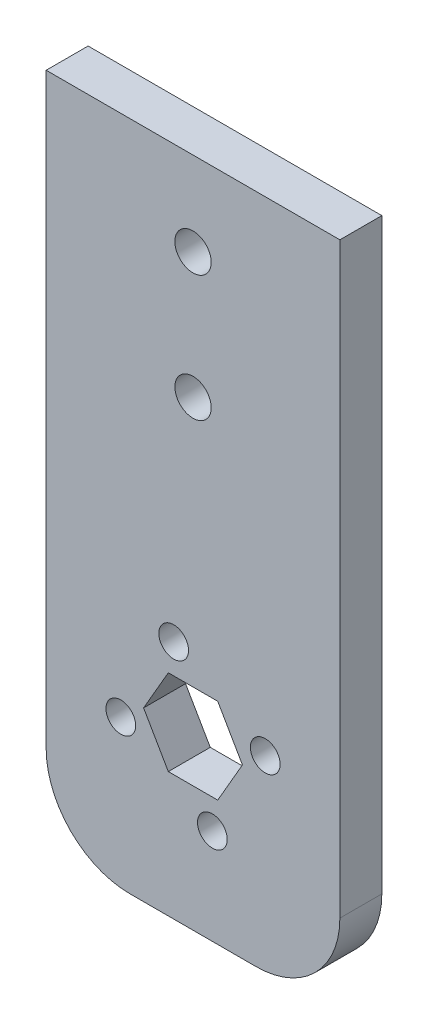
ISO-10303-21;
HEADER;
FILE_DESCRIPTION(('STEP AP214'),'2;1');
FILE_NAME('part.step','',(''),(''),'','','');
FILE_SCHEMA(('AUTOMOTIVE_DESIGN { 1 0 10303 214 1 1 1 1 }'));
ENDSEC;
DATA;
#1=APPLICATION_CONTEXT('core data for automotive mechanical design processes');
#2=APPLICATION_PROTOCOL_DEFINITION('international standard','automotive_design',2000,#1);
#3=PRODUCT_CONTEXT('',#1,'mechanical');
#4=PRODUCT('Part','Part','',(#3));
#5=PRODUCT_RELATED_PRODUCT_CATEGORY('part','',(#4));
#6=PRODUCT_DEFINITION_FORMATION('','',#4);
#7=PRODUCT_DEFINITION_CONTEXT('part definition',#1,'design');
#8=PRODUCT_DEFINITION('design','',#6,#7);
#9=PRODUCT_DEFINITION_SHAPE('','',#8);
#10=(LENGTH_UNIT() NAMED_UNIT(*) SI_UNIT(.MILLI.,.METRE.));
#11=(NAMED_UNIT(*) PLANE_ANGLE_UNIT() SI_UNIT($,.RADIAN.));
#12=(NAMED_UNIT(*) SI_UNIT($,.STERADIAN.) SOLID_ANGLE_UNIT());
#13=UNCERTAINTY_MEASURE_WITH_UNIT(LENGTH_MEASURE(1.E-05),#10,'distance_accuracy_value','');
#14=(GEOMETRIC_REPRESENTATION_CONTEXT(3) GLOBAL_UNCERTAINTY_ASSIGNED_CONTEXT((#13)) GLOBAL_UNIT_ASSIGNED_CONTEXT((#10,
#11,#12)) REPRESENTATION_CONTEXT('',''));
#15=CARTESIAN_POINT('',(0.,0.,0.));
#16=DIRECTION('',(0.,0.,1.));
#17=DIRECTION('',(1.,0.,0.));
#18=AXIS2_PLACEMENT_3D('',#15,#16,#17);
#19=CARTESIAN_POINT('',(0.,0.,0.));
#20=DIRECTION('',(0.,0.,1.));
#21=DIRECTION('',(1.,0.,0.));
#22=AXIS2_PLACEMENT_3D('',#19,#20,#21);
#23=PLANE('',#22);
#24=CARTESIAN_POINT('',(-25.1532032302754,36.3282032302756,0.));
#25=DIRECTION('',(0.,0.,-1.));
#26=DIRECTION('',(-1.,0.,0.));
#27=AXIS2_PLACEMENT_3D('',#24,#25,#26);
#28=CIRCLE('',#27,2.25);
#29=CARTESIAN_POINT('',(-27.4032032302754,36.3282032302756,0.));
#30=VERTEX_POINT('',#29);
#31=EDGE_CURVE('E509',#30,#30,#28,.T.);
#32=ORIENTED_EDGE('',*,*,#31,.F.);
#33=EDGE_LOOP('',(#32));
#34=FACE_BOUND('',#33,.T.);
#35=CARTESIAN_POINT('',(-33.1532032302755,22.4717967697245,0.));
#36=DIRECTION('',(0.,0.,-1.));
#37=DIRECTION('',(-1.,0.,0.));
#38=AXIS2_PLACEMENT_3D('',#35,#36,#37);
#39=CIRCLE('',#38,2.25);
#40=CARTESIAN_POINT('',(-35.4032032302755,22.4717967697245,0.));
#41=VERTEX_POINT('',#40);
#42=EDGE_CURVE('E519',#41,#41,#39,.T.);
#43=ORIENTED_EDGE('',*,*,#42,.F.);
#44=EDGE_LOOP('',(#43));
#45=FACE_BOUND('',#44,.T.);
#46=CARTESIAN_POINT('',(-19.2967967697245,14.4717967697245,0.));
#47=DIRECTION('',(0.,0.,-1.));
#48=DIRECTION('',(-1.,0.,0.));
#49=AXIS2_PLACEMENT_3D('',#46,#47,#48);
#50=CIRCLE('',#49,2.25);
#51=CARTESIAN_POINT('',(-21.5467967697245,14.4717967697245,0.));
#52=VERTEX_POINT('',#51);
#53=EDGE_CURVE('E526',#52,#52,#50,.T.);
#54=ORIENTED_EDGE('',*,*,#53,.F.);
#55=EDGE_LOOP('',(#54));
#56=FACE_BOUND('',#55,.T.);
#57=DIRECTION('',(1.,0.,0.));
#58=VECTOR('',#57,1.);
#59=CARTESIAN_POINT('',(-25.9644976935412,18.923,0.));
#60=LINE('',#59,#58);
#61=CARTESIAN_POINT('',(-25.9644976935412,18.923,0.));
#62=VERTEX_POINT('',#61);
#63=CARTESIAN_POINT('',(-18.4855023064588,18.923,0.));
#64=VERTEX_POINT('',#63);
#65=EDGE_CURVE('E142',#62,#64,#60,.T.);
#66=ORIENTED_EDGE('',*,*,#65,.T.);
#67=DIRECTION('',(0.500000000000001,0.866025403784438,0.));
#68=VECTOR('',#67,1.);
#69=CARTESIAN_POINT('',(-18.4855023064588,18.923,0.));
#70=LINE('',#69,#68);
#71=CARTESIAN_POINT('',(-14.7460046129176,25.4,0.));
#72=VERTEX_POINT('',#71);
#73=EDGE_CURVE('E135',#64,#72,#70,.T.);
#74=ORIENTED_EDGE('',*,*,#73,.T.);
#75=DIRECTION('',(-0.499999999999999,0.866025403784439,0.));
#76=VECTOR('',#75,1.);
#77=CARTESIAN_POINT('',(-14.7460046129176,25.4,0.));
#78=LINE('',#77,#76);
#79=CARTESIAN_POINT('',(-18.4855023064588,31.877,0.));
#80=VERTEX_POINT('',#79);
#81=EDGE_CURVE('E145',#72,#80,#78,.T.);
#82=ORIENTED_EDGE('',*,*,#81,.T.);
#83=DIRECTION('',(-1.,0.,0.));
#84=VECTOR('',#83,1.);
#85=CARTESIAN_POINT('',(-18.4855023064588,31.877,0.));
#86=LINE('',#85,#84);
#87=CARTESIAN_POINT('',(-25.9644976935412,31.877,0.));
#88=VERTEX_POINT('',#87);
#89=EDGE_CURVE('E67',#80,#88,#86,.T.);
#90=ORIENTED_EDGE('',*,*,#89,.T.);
#91=DIRECTION('',(-0.5,-0.866025403784438,0.));
#92=VECTOR('',#91,1.);
#93=CARTESIAN_POINT('',(-25.9644976935412,31.877,0.));
#94=LINE('',#93,#92);
#95=CARTESIAN_POINT('',(-29.7039953870824,25.4,0.));
#96=VERTEX_POINT('',#95);
#97=EDGE_CURVE('E166',#88,#96,#94,.T.);
#98=ORIENTED_EDGE('',*,*,#97,.T.);
#99=DIRECTION('',(0.499999999999999,-0.866025403784439,0.));
#100=VECTOR('',#99,1.);
#101=CARTESIAN_POINT('',(-29.7039953870824,25.4,0.));
#102=LINE('',#101,#100);
#103=EDGE_CURVE('E170',#96,#62,#102,.T.);
#104=ORIENTED_EDGE('',*,*,#103,.T.);
#105=EDGE_LOOP('',(#66,#74,#82,#90,#98,#104));
#106=FACE_BOUND('',#105,.T.);
#107=CARTESIAN_POINT('',(-22.225,88.9,0.));
#108=DIRECTION('',(0.,0.,-1.));
#109=DIRECTION('',(-1.,0.,0.));
#110=AXIS2_PLACEMENT_3D('',#107,#108,#109);
#111=CIRCLE('',#110,2.75);
#112=CARTESIAN_POINT('',(-24.975,88.9,0.));
#113=VERTEX_POINT('',#112);
#114=EDGE_CURVE('E194',#113,#113,#111,.T.);
#115=ORIENTED_EDGE('',*,*,#114,.F.);
#116=EDGE_LOOP('',(#115));
#117=FACE_BOUND('',#116,.T.);
#118=CARTESIAN_POINT('',(-22.225,69.85,0.));
#119=DIRECTION('',(0.,0.,-1.));
#120=DIRECTION('',(-1.,0.,0.));
#121=AXIS2_PLACEMENT_3D('',#118,#119,#120);
#122=CIRCLE('',#121,2.75);
#123=CARTESIAN_POINT('',(-24.975,69.85,0.));
#124=VERTEX_POINT('',#123);
#125=EDGE_CURVE('E213',#124,#124,#122,.T.);
#126=ORIENTED_EDGE('',*,*,#125,.F.);
#127=EDGE_LOOP('',(#126));
#128=FACE_BOUND('',#127,.T.);
#129=DIRECTION('',(1.,0.,0.));
#130=VECTOR('',#129,1.);
#131=CARTESIAN_POINT('',(0.,0.,0.));
#132=LINE('',#131,#130);
#133=CARTESIAN_POINT('',(-31.75,0.,0.));
#134=VERTEX_POINT('',#133);
#135=CARTESIAN_POINT('',(-12.7,0.,0.));
#136=VERTEX_POINT('',#135);
#137=EDGE_CURVE('E226',#134,#136,#132,.T.);
#138=ORIENTED_EDGE('',*,*,#137,.F.);
#139=CARTESIAN_POINT('',(-31.75,12.7,0.));
#140=DIRECTION('',(0.,0.,1.));
#141=DIRECTION('',(1.,0.,0.));
#142=AXIS2_PLACEMENT_3D('',#139,#140,#141);
#143=CIRCLE('',#142,12.7);
#144=CARTESIAN_POINT('',(-44.45,12.7,0.));
#145=VERTEX_POINT('',#144);
#146=EDGE_CURVE('E267',#134,#145,#143,.F.);
#147=ORIENTED_EDGE('',*,*,#146,.T.);
#148=DIRECTION('',(0.,-1.,0.));
#149=VECTOR('',#148,1.);
#150=CARTESIAN_POINT('',(-44.45,0.,0.));
#151=LINE('',#150,#149);
#152=CARTESIAN_POINT('',(-44.45,101.6,0.));
#153=VERTEX_POINT('',#152);
#154=EDGE_CURVE('E243',#153,#145,#151,.T.);
#155=ORIENTED_EDGE('',*,*,#154,.F.);
#156=DIRECTION('',(-1.,0.,0.));
#157=VECTOR('',#156,1.);
#158=CARTESIAN_POINT('',(0.,101.6,0.));
#159=LINE('',#158,#157);
#160=CARTESIAN_POINT('',(0.,101.6,0.));
#161=VERTEX_POINT('',#160);
#162=EDGE_CURVE('E240',#161,#153,#159,.T.);
#163=ORIENTED_EDGE('',*,*,#162,.F.);
#164=DIRECTION('',(0.,1.,0.));
#165=VECTOR('',#164,1.);
#166=CARTESIAN_POINT('',(0.,0.,0.));
#167=LINE('',#166,#165);
#168=CARTESIAN_POINT('',(0.,12.7,0.));
#169=VERTEX_POINT('',#168);
#170=EDGE_CURVE('E221',#169,#161,#167,.T.);
#171=ORIENTED_EDGE('',*,*,#170,.F.);
#172=CARTESIAN_POINT('',(-12.7,12.7,0.));
#173=DIRECTION('',(0.,0.,1.));
#174=DIRECTION('',(1.,0.,0.));
#175=AXIS2_PLACEMENT_3D('',#172,#173,#174);
#176=CIRCLE('',#175,12.7);
#177=EDGE_CURVE('E264',#169,#136,#176,.F.);
#178=ORIENTED_EDGE('',*,*,#177,.T.);
#179=EDGE_LOOP('',(#138,#147,#155,#163,#171,#178));
#180=FACE_BOUND('',#179,.T.);
#181=CARTESIAN_POINT('',(-11.2967967697244,28.3282032302755,0.));
#182=DIRECTION('',(0.,0.,-1.));
#183=DIRECTION('',(-1.,0.,0.));
#184=AXIS2_PLACEMENT_3D('',#181,#182,#183);
#185=CIRCLE('',#184,2.25);
#186=CARTESIAN_POINT('',(-13.5467967697244,28.3282032302755,0.));
#187=VERTEX_POINT('',#186);
#188=EDGE_CURVE('E505',#187,#187,#185,.T.);
#189=ORIENTED_EDGE('',*,*,#188,.F.);
#190=EDGE_LOOP('',(#189));
#191=FACE_BOUND('',#190,.T.);
#192=ADVANCED_FACE('F43',(#34,#45,#56,#106,#117,#128,#180,#191),#23,.F.);
#193=CARTESIAN_POINT('',(0.,0.,6.35));
#194=DIRECTION('',(0.,0.,1.));
#195=DIRECTION('',(1.,0.,0.));
#196=AXIS2_PLACEMENT_3D('',#193,#194,#195);
#197=PLANE('',#196);
#198=CARTESIAN_POINT('',(-11.2967967697244,28.3282032302755,6.35));
#199=DIRECTION('',(0.,0.,-1.));
#200=DIRECTION('',(-1.,0.,0.));
#201=AXIS2_PLACEMENT_3D('',#198,#199,#200);
#202=CIRCLE('',#201,2.25);
#203=CARTESIAN_POINT('',(-13.5467967697244,28.3282032302755,6.35));
#204=VERTEX_POINT('',#203);
#205=EDGE_CURVE('E502',#204,#204,#202,.T.);
#206=ORIENTED_EDGE('',*,*,#205,.T.);
#207=EDGE_LOOP('',(#206));
#208=FACE_BOUND('',#207,.T.);
#209=DIRECTION('',(0.,-1.,0.));
#210=VECTOR('',#209,1.);
#211=CARTESIAN_POINT('',(-44.45,0.,6.35));
#212=LINE('',#211,#210);
#213=CARTESIAN_POINT('',(-44.45,101.6,6.35));
#214=VERTEX_POINT('',#213);
#215=CARTESIAN_POINT('',(-44.45,12.7,6.35));
#216=VERTEX_POINT('',#215);
#217=EDGE_CURVE('E229',#214,#216,#212,.T.);
#218=ORIENTED_EDGE('',*,*,#217,.T.);
#219=CARTESIAN_POINT('',(-31.75,12.7,6.35));
#220=DIRECTION('',(0.,0.,1.));
#221=DIRECTION('',(1.,0.,0.));
#222=AXIS2_PLACEMENT_3D('',#219,#220,#221);
#223=CIRCLE('',#222,12.7);
#224=CARTESIAN_POINT('',(-31.75,0.,6.35));
#225=VERTEX_POINT('',#224);
#226=EDGE_CURVE('E52',#216,#225,#223,.T.);
#227=ORIENTED_EDGE('',*,*,#226,.T.);
#228=DIRECTION('',(1.,0.,0.));
#229=VECTOR('',#228,1.);
#230=CARTESIAN_POINT('',(0.,0.,6.35));
#231=LINE('',#230,#229);
#232=CARTESIAN_POINT('',(-12.7,0.,6.35));
#233=VERTEX_POINT('',#232);
#234=EDGE_CURVE('E233',#225,#233,#231,.T.);
#235=ORIENTED_EDGE('',*,*,#234,.T.);
#236=CARTESIAN_POINT('',(-12.7,12.7,6.35));
#237=DIRECTION('',(0.,0.,1.));
#238=DIRECTION('',(1.,0.,0.));
#239=AXIS2_PLACEMENT_3D('',#236,#237,#238);
#240=CIRCLE('',#239,12.7);
#241=CARTESIAN_POINT('',(0.,12.7,6.35));
#242=VERTEX_POINT('',#241);
#243=EDGE_CURVE('E273',#233,#242,#240,.T.);
#244=ORIENTED_EDGE('',*,*,#243,.T.);
#245=DIRECTION('',(0.,1.,0.));
#246=VECTOR('',#245,1.);
#247=CARTESIAN_POINT('',(0.,0.,6.35));
#248=LINE('',#247,#246);
#249=CARTESIAN_POINT('',(0.,101.6,6.35));
#250=VERTEX_POINT('',#249);
#251=EDGE_CURVE('E222',#242,#250,#248,.T.);
#252=ORIENTED_EDGE('',*,*,#251,.T.);
#253=DIRECTION('',(-1.,0.,0.));
#254=VECTOR('',#253,1.);
#255=CARTESIAN_POINT('',(0.,101.6,6.35));
#256=LINE('',#255,#254);
#257=EDGE_CURVE('E225',#250,#214,#256,.T.);
#258=ORIENTED_EDGE('',*,*,#257,.T.);
#259=EDGE_LOOP('',(#218,#227,#235,#244,#252,#258));
#260=FACE_BOUND('',#259,.T.);
#261=CARTESIAN_POINT('',(-22.225,69.85,6.35));
#262=DIRECTION('',(0.,0.,-1.));
#263=DIRECTION('',(-1.,0.,0.));
#264=AXIS2_PLACEMENT_3D('',#261,#262,#263);
#265=CIRCLE('',#264,2.75);
#266=CARTESIAN_POINT('',(-24.975,69.85,6.35));
#267=VERTEX_POINT('',#266);
#268=EDGE_CURVE('E217',#267,#267,#265,.T.);
#269=ORIENTED_EDGE('',*,*,#268,.T.);
#270=EDGE_LOOP('',(#269));
#271=FACE_BOUND('',#270,.T.);
#272=CARTESIAN_POINT('',(-22.225,88.9,6.35));
#273=DIRECTION('',(0.,0.,-1.));
#274=DIRECTION('',(-1.,0.,0.));
#275=AXIS2_PLACEMENT_3D('',#272,#273,#274);
#276=CIRCLE('',#275,2.75);
#277=CARTESIAN_POINT('',(-24.975,88.9,6.35));
#278=VERTEX_POINT('',#277);
#279=EDGE_CURVE('E209',#278,#278,#276,.T.);
#280=ORIENTED_EDGE('',*,*,#279,.T.);
#281=EDGE_LOOP('',(#280));
#282=FACE_BOUND('',#281,.T.);
#283=DIRECTION('',(0.500000000000001,0.866025403784438,0.));
#284=VECTOR('',#283,1.);
#285=CARTESIAN_POINT('',(-18.4855023064588,18.923,6.35));
#286=LINE('',#285,#284);
#287=CARTESIAN_POINT('',(-18.4855023064588,18.923,6.35));
#288=VERTEX_POINT('',#287);
#289=CARTESIAN_POINT('',(-14.7460046129176,25.4,6.35));
#290=VERTEX_POINT('',#289);
#291=EDGE_CURVE('E59',#288,#290,#286,.T.);
#292=ORIENTED_EDGE('',*,*,#291,.F.);
#293=DIRECTION('',(1.,0.,0.));
#294=VECTOR('',#293,1.);
#295=CARTESIAN_POINT('',(-25.9644976935412,18.923,6.35));
#296=LINE('',#295,#294);
#297=CARTESIAN_POINT('',(-25.9644976935412,18.923,6.35));
#298=VERTEX_POINT('',#297);
#299=EDGE_CURVE('E154',#298,#288,#296,.T.);
#300=ORIENTED_EDGE('',*,*,#299,.F.);
#301=DIRECTION('',(0.499999999999999,-0.866025403784439,0.));
#302=VECTOR('',#301,1.);
#303=CARTESIAN_POINT('',(-29.7039953870824,25.4,6.35));
#304=LINE('',#303,#302);
#305=CARTESIAN_POINT('',(-29.7039953870824,25.4,6.35));
#306=VERTEX_POINT('',#305);
#307=EDGE_CURVE('E158',#306,#298,#304,.T.);
#308=ORIENTED_EDGE('',*,*,#307,.F.);
#309=DIRECTION('',(-0.5,-0.866025403784438,0.));
#310=VECTOR('',#309,1.);
#311=CARTESIAN_POINT('',(-25.9644976935412,31.877,6.35));
#312=LINE('',#311,#310);
#313=CARTESIAN_POINT('',(-25.9644976935412,31.877,6.35));
#314=VERTEX_POINT('',#313);
#315=EDGE_CURVE('E184',#314,#306,#312,.T.);
#316=ORIENTED_EDGE('',*,*,#315,.F.);
#317=DIRECTION('',(-1.,0.,0.));
#318=VECTOR('',#317,1.);
#319=CARTESIAN_POINT('',(-18.4855023064588,31.877,6.35));
#320=LINE('',#319,#318);
#321=CARTESIAN_POINT('',(-18.4855023064588,31.877,6.35));
#322=VERTEX_POINT('',#321);
#323=EDGE_CURVE('E180',#322,#314,#320,.T.);
#324=ORIENTED_EDGE('',*,*,#323,.F.);
#325=DIRECTION('',(-0.499999999999999,0.866025403784439,0.));
#326=VECTOR('',#325,1.);
#327=CARTESIAN_POINT('',(-14.7460046129176,25.4,6.35));
#328=LINE('',#327,#326);
#329=EDGE_CURVE('E177',#290,#322,#328,.T.);
#330=ORIENTED_EDGE('',*,*,#329,.F.);
#331=EDGE_LOOP('',(#292,#300,#308,#316,#324,#330));
#332=FACE_BOUND('',#331,.T.);
#333=CARTESIAN_POINT('',(-19.2967967697245,14.4717967697245,6.35));
#334=DIRECTION('',(0.,0.,-1.));
#335=DIRECTION('',(-1.,0.,0.));
#336=AXIS2_PLACEMENT_3D('',#333,#334,#335);
#337=CIRCLE('',#336,2.25);
#338=CARTESIAN_POINT('',(-21.5467967697245,14.4717967697245,6.35));
#339=VERTEX_POINT('',#338);
#340=EDGE_CURVE('E161',#339,#339,#337,.T.);
#341=ORIENTED_EDGE('',*,*,#340,.T.);
#342=EDGE_LOOP('',(#341));
#343=FACE_BOUND('',#342,.T.);
#344=CARTESIAN_POINT('',(-33.1532032302755,22.4717967697245,6.35));
#345=DIRECTION('',(0.,0.,-1.));
#346=DIRECTION('',(-1.,0.,0.));
#347=AXIS2_PLACEMENT_3D('',#344,#345,#346);
#348=CIRCLE('',#347,2.25);
#349=CARTESIAN_POINT('',(-35.4032032302755,22.4717967697245,6.35));
#350=VERTEX_POINT('',#349);
#351=EDGE_CURVE('E523',#350,#350,#348,.T.);
#352=ORIENTED_EDGE('',*,*,#351,.T.);
#353=EDGE_LOOP('',(#352));
#354=FACE_BOUND('',#353,.T.);
#355=CARTESIAN_POINT('',(-25.1532032302754,36.3282032302756,6.35));
#356=DIRECTION('',(0.,0.,-1.));
#357=DIRECTION('',(-1.,0.,0.));
#358=AXIS2_PLACEMENT_3D('',#355,#356,#357);
#359=CIRCLE('',#358,2.25);
#360=CARTESIAN_POINT('',(-27.4032032302754,36.3282032302756,6.35));
#361=VERTEX_POINT('',#360);
#362=EDGE_CURVE('E515',#361,#361,#359,.T.);
#363=ORIENTED_EDGE('',*,*,#362,.T.);
#364=EDGE_LOOP('',(#363));
#365=FACE_BOUND('',#364,.T.);
#366=ADVANCED_FACE('F279',(#208,#260,#271,#282,#332,#343,#354,#365),#197,.T.);
#367=CARTESIAN_POINT('',(0.,0.,6.35));
#368=DIRECTION('',(-1.,0.,0.));
#369=DIRECTION('',(0.,0.,1.));
#370=AXIS2_PLACEMENT_3D('',#367,#368,#369);
#371=PLANE('',#370);
#372=ORIENTED_EDGE('',*,*,#251,.F.);
#373=DIRECTION('',(0.,0.,-1.));
#374=VECTOR('',#373,1.);
#375=CARTESIAN_POINT('',(0.,12.7,6.35));
#376=LINE('',#375,#374);
#377=EDGE_CURVE('E11',#242,#169,#376,.T.);
#378=ORIENTED_EDGE('',*,*,#377,.T.);
#379=ORIENTED_EDGE('',*,*,#170,.T.);
#380=DIRECTION('',(0.,0.,-1.));
#381=VECTOR('',#380,1.);
#382=CARTESIAN_POINT('',(0.,101.6,6.35));
#383=LINE('',#382,#381);
#384=EDGE_CURVE('E253',#250,#161,#383,.T.);
#385=ORIENTED_EDGE('',*,*,#384,.F.);
#386=EDGE_LOOP('',(#372,#378,#379,#385));
#387=FACE_BOUND('',#386,.T.);
#388=ADVANCED_FACE('F305',(#387),#371,.F.);
#389=CARTESIAN_POINT('',(0.,101.6,6.35));
#390=DIRECTION('',(0.,-1.,0.));
#391=DIRECTION('',(0.,0.,-1.));
#392=AXIS2_PLACEMENT_3D('',#389,#390,#391);
#393=PLANE('',#392);
#394=ORIENTED_EDGE('',*,*,#162,.T.);
#395=DIRECTION('',(0.,0.,-1.));
#396=VECTOR('',#395,1.);
#397=CARTESIAN_POINT('',(-44.45,101.6,6.35));
#398=LINE('',#397,#396);
#399=EDGE_CURVE('E237',#214,#153,#398,.T.);
#400=ORIENTED_EDGE('',*,*,#399,.F.);
#401=ORIENTED_EDGE('',*,*,#257,.F.);
#402=ORIENTED_EDGE('',*,*,#384,.T.);
#403=EDGE_LOOP('',(#394,#400,#401,#402));
#404=FACE_BOUND('',#403,.T.);
#405=ADVANCED_FACE('F300',(#404),#393,.F.);
#406=CARTESIAN_POINT('',(-44.45,0.,6.35));
#407=DIRECTION('',(1.,0.,0.));
#408=DIRECTION('',(0.,0.,-1.));
#409=AXIS2_PLACEMENT_3D('',#406,#407,#408);
#410=PLANE('',#409);
#411=ORIENTED_EDGE('',*,*,#154,.T.);
#412=DIRECTION('',(0.,0.,-1.));
#413=VECTOR('',#412,1.);
#414=CARTESIAN_POINT('',(-44.45,12.7,6.35));
#415=LINE('',#414,#413);
#416=EDGE_CURVE('E270',#145,#216,#415,.F.);
#417=ORIENTED_EDGE('',*,*,#416,.T.);
#418=ORIENTED_EDGE('',*,*,#217,.F.);
#419=ORIENTED_EDGE('',*,*,#399,.T.);
#420=EDGE_LOOP('',(#411,#417,#418,#419));
#421=FACE_BOUND('',#420,.T.);
#422=ADVANCED_FACE('F296',(#421),#410,.F.);
#423=CARTESIAN_POINT('',(0.,0.,6.35));
#424=DIRECTION('',(0.,1.,0.));
#425=DIRECTION('',(0.,0.,1.));
#426=AXIS2_PLACEMENT_3D('',#423,#424,#425);
#427=PLANE('',#426);
#428=ORIENTED_EDGE('',*,*,#234,.F.);
#429=DIRECTION('',(0.,0.,-1.));
#430=VECTOR('',#429,1.);
#431=CARTESIAN_POINT('',(-31.75,0.,6.35));
#432=LINE('',#431,#430);
#433=EDGE_CURVE('E260',#225,#134,#432,.T.);
#434=ORIENTED_EDGE('',*,*,#433,.T.);
#435=ORIENTED_EDGE('',*,*,#137,.T.);
#436=DIRECTION('',(0.,0.,-1.));
#437=VECTOR('',#436,1.);
#438=CARTESIAN_POINT('',(-12.7,0.,6.35));
#439=LINE('',#438,#437);
#440=EDGE_CURVE('E257',#136,#233,#439,.F.);
#441=ORIENTED_EDGE('',*,*,#440,.T.);
#442=EDGE_LOOP('',(#428,#434,#435,#441));
#443=FACE_BOUND('',#442,.T.);
#444=ADVANCED_FACE('F287',(#443),#427,.F.);
#445=CARTESIAN_POINT('',(-31.75,12.7,6.35));
#446=DIRECTION('',(0.,0.,-1.));
#447=DIRECTION('',(-1.,0.,0.));
#448=AXIS2_PLACEMENT_3D('',#445,#446,#447);
#449=CYLINDRICAL_SURFACE('',#448,12.7);
#450=ORIENTED_EDGE('',*,*,#226,.F.);
#451=ORIENTED_EDGE('',*,*,#416,.F.);
#452=ORIENTED_EDGE('',*,*,#146,.F.);
#453=ORIENTED_EDGE('',*,*,#433,.F.);
#454=EDGE_LOOP('',(#450,#451,#452,#453));
#455=FACE_BOUND('',#454,.T.);
#456=ADVANCED_FACE('F290',(#455),#449,.T.);
#457=CARTESIAN_POINT('',(-12.7,12.7,6.35));
#458=DIRECTION('',(0.,0.,-1.));
#459=DIRECTION('',(-1.,0.,0.));
#460=AXIS2_PLACEMENT_3D('',#457,#458,#459);
#461=CYLINDRICAL_SURFACE('',#460,12.7);
#462=ORIENTED_EDGE('',*,*,#243,.F.);
#463=ORIENTED_EDGE('',*,*,#440,.F.);
#464=ORIENTED_EDGE('',*,*,#177,.F.);
#465=ORIENTED_EDGE('',*,*,#377,.F.);
#466=EDGE_LOOP('',(#462,#463,#464,#465));
#467=FACE_BOUND('',#466,.T.);
#468=ADVANCED_FACE('F45',(#467),#461,.T.);
#469=CARTESIAN_POINT('',(-22.225,69.85,0.));
#470=DIRECTION('',(0.,0.,-1.));
#471=DIRECTION('',(-1.,0.,0.));
#472=AXIS2_PLACEMENT_3D('',#469,#470,#471);
#473=CYLINDRICAL_SURFACE('',#472,2.75);
#474=ORIENTED_EDGE('',*,*,#268,.F.);
#475=EDGE_LOOP('',(#474));
#476=FACE_BOUND('',#475,.T.);
#477=ORIENTED_EDGE('',*,*,#125,.T.);
#478=EDGE_LOOP('',(#477));
#479=FACE_BOUND('',#478,.T.);
#480=ADVANCED_FACE('F309',(#476,#479),#473,.F.);
#481=CARTESIAN_POINT('',(-22.225,88.9,0.));
#482=DIRECTION('',(0.,0.,-1.));
#483=DIRECTION('',(-1.,0.,0.));
#484=AXIS2_PLACEMENT_3D('',#481,#482,#483);
#485=CYLINDRICAL_SURFACE('',#484,2.75);
#486=ORIENTED_EDGE('',*,*,#279,.F.);
#487=EDGE_LOOP('',(#486));
#488=FACE_BOUND('',#487,.T.);
#489=ORIENTED_EDGE('',*,*,#114,.T.);
#490=EDGE_LOOP('',(#489));
#491=FACE_BOUND('',#490,.T.);
#492=ADVANCED_FACE('F314',(#488,#491),#485,.F.);
#493=CARTESIAN_POINT('',(-18.4855023064588,18.923,0.));
#494=DIRECTION('',(0.866025403784438,-0.500000000000001,0.));
#495=DIRECTION('',(0.500000000000001,0.866025403784438,0.));
#496=AXIS2_PLACEMENT_3D('',#493,#494,#495);
#497=PLANE('',#496);
#498=ORIENTED_EDGE('',*,*,#291,.T.);
#499=DIRECTION('',(0.,0.,1.));
#500=VECTOR('',#499,1.);
#501=CARTESIAN_POINT('',(-14.7460046129176,25.4,0.));
#502=LINE('',#501,#500);
#503=EDGE_CURVE('E131',#72,#290,#502,.T.);
#504=ORIENTED_EDGE('',*,*,#503,.F.);
#505=ORIENTED_EDGE('',*,*,#73,.F.);
#506=DIRECTION('',(0.,0.,1.));
#507=VECTOR('',#506,1.);
#508=CARTESIAN_POINT('',(-18.4855023064588,18.923,0.));
#509=LINE('',#508,#507);
#510=EDGE_CURVE('E191',#64,#288,#509,.T.);
#511=ORIENTED_EDGE('',*,*,#510,.T.);
#512=EDGE_LOOP('',(#498,#504,#505,#511));
#513=FACE_BOUND('',#512,.T.);
#514=ADVANCED_FACE('F133',(#513),#497,.F.);
#515=CARTESIAN_POINT('',(-25.9644976935412,18.923,0.));
#516=DIRECTION('',(0.,-1.,0.));
#517=DIRECTION('',(1.,0.,0.));
#518=AXIS2_PLACEMENT_3D('',#515,#516,#517);
#519=PLANE('',#518);
#520=ORIENTED_EDGE('',*,*,#299,.T.);
#521=ORIENTED_EDGE('',*,*,#510,.F.);
#522=ORIENTED_EDGE('',*,*,#65,.F.);
#523=DIRECTION('',(0.,0.,1.));
#524=VECTOR('',#523,1.);
#525=CARTESIAN_POINT('',(-25.9644976935412,18.923,0.));
#526=LINE('',#525,#524);
#527=EDGE_CURVE('E195',#62,#298,#526,.T.);
#528=ORIENTED_EDGE('',*,*,#527,.T.);
#529=EDGE_LOOP('',(#520,#521,#522,#528));
#530=FACE_BOUND('',#529,.T.);
#531=ADVANCED_FACE('F387',(#530),#519,.F.);
#532=CARTESIAN_POINT('',(-29.7039953870824,25.4,0.));
#533=DIRECTION('',(-0.866025403784439,-0.499999999999999,0.));
#534=DIRECTION('',(0.499999999999999,-0.866025403784439,0.));
#535=AXIS2_PLACEMENT_3D('',#532,#533,#534);
#536=PLANE('',#535);
#537=ORIENTED_EDGE('',*,*,#307,.T.);
#538=ORIENTED_EDGE('',*,*,#527,.F.);
#539=ORIENTED_EDGE('',*,*,#103,.F.);
#540=DIRECTION('',(0.,0.,1.));
#541=VECTOR('',#540,1.);
#542=CARTESIAN_POINT('',(-29.7039953870824,25.4,0.));
#543=LINE('',#542,#541);
#544=EDGE_CURVE('E198',#96,#306,#543,.T.);
#545=ORIENTED_EDGE('',*,*,#544,.T.);
#546=EDGE_LOOP('',(#537,#538,#539,#545));
#547=FACE_BOUND('',#546,.T.);
#548=ADVANCED_FACE('F397',(#547),#536,.F.);
#549=CARTESIAN_POINT('',(-25.9644976935412,31.877,0.));
#550=DIRECTION('',(-0.866025403784439,0.5,0.));
#551=DIRECTION('',(-0.5,-0.866025403784439,0.));
#552=AXIS2_PLACEMENT_3D('',#549,#550,#551);
#553=PLANE('',#552);
#554=ORIENTED_EDGE('',*,*,#315,.T.);
#555=ORIENTED_EDGE('',*,*,#544,.F.);
#556=ORIENTED_EDGE('',*,*,#97,.F.);
#557=DIRECTION('',(0.,0.,1.));
#558=VECTOR('',#557,1.);
#559=CARTESIAN_POINT('',(-25.9644976935412,31.877,0.));
#560=LINE('',#559,#558);
#561=EDGE_CURVE('E201',#88,#314,#560,.T.);
#562=ORIENTED_EDGE('',*,*,#561,.T.);
#563=EDGE_LOOP('',(#554,#555,#556,#562));
#564=FACE_BOUND('',#563,.T.);
#565=ADVANCED_FACE('F408',(#564),#553,.F.);
#566=CARTESIAN_POINT('',(-18.4855023064588,31.877,0.));
#567=DIRECTION('',(0.,1.,0.));
#568=DIRECTION('',(-1.,0.,0.));
#569=AXIS2_PLACEMENT_3D('',#566,#567,#568);
#570=PLANE('',#569);
#571=ORIENTED_EDGE('',*,*,#323,.T.);
#572=ORIENTED_EDGE('',*,*,#561,.F.);
#573=ORIENTED_EDGE('',*,*,#89,.F.);
#574=DIRECTION('',(0.,0.,1.));
#575=VECTOR('',#574,1.);
#576=CARTESIAN_POINT('',(-18.4855023064588,31.877,0.));
#577=LINE('',#576,#575);
#578=EDGE_CURVE('E141',#80,#322,#577,.T.);
#579=ORIENTED_EDGE('',*,*,#578,.T.);
#580=EDGE_LOOP('',(#571,#572,#573,#579));
#581=FACE_BOUND('',#580,.T.);
#582=ADVANCED_FACE('F419',(#581),#570,.F.);
#583=CARTESIAN_POINT('',(-14.7460046129176,25.4,0.));
#584=DIRECTION('',(0.866025403784439,0.499999999999999,0.));
#585=DIRECTION('',(-0.499999999999999,0.86602540378444,0.));
#586=AXIS2_PLACEMENT_3D('',#583,#584,#585);
#587=PLANE('',#586);
#588=ORIENTED_EDGE('',*,*,#329,.T.);
#589=ORIENTED_EDGE('',*,*,#578,.F.);
#590=ORIENTED_EDGE('',*,*,#81,.F.);
#591=ORIENTED_EDGE('',*,*,#503,.T.);
#592=EDGE_LOOP('',(#588,#589,#590,#591));
#593=FACE_BOUND('',#592,.T.);
#594=ADVANCED_FACE('F146',(#593),#587,.F.);
#595=CARTESIAN_POINT('',(-19.2967967697245,14.4717967697245,0.));
#596=DIRECTION('',(0.,0.,-1.));
#597=DIRECTION('',(-1.,0.,0.));
#598=AXIS2_PLACEMENT_3D('',#595,#596,#597);
#599=CYLINDRICAL_SURFACE('',#598,2.25);
#600=ORIENTED_EDGE('',*,*,#340,.F.);
#601=EDGE_LOOP('',(#600));
#602=FACE_BOUND('',#601,.T.);
#603=ORIENTED_EDGE('',*,*,#53,.T.);
#604=EDGE_LOOP('',(#603));
#605=FACE_BOUND('',#604,.T.);
#606=ADVANCED_FACE('F438',(#602,#605),#599,.F.);
#607=CARTESIAN_POINT('',(-33.1532032302755,22.4717967697245,0.));
#608=DIRECTION('',(0.,0.,-1.));
#609=DIRECTION('',(-1.,0.,0.));
#610=AXIS2_PLACEMENT_3D('',#607,#608,#609);
#611=CYLINDRICAL_SURFACE('',#610,2.25);
#612=ORIENTED_EDGE('',*,*,#351,.F.);
#613=EDGE_LOOP('',(#612));
#614=FACE_BOUND('',#613,.T.);
#615=ORIENTED_EDGE('',*,*,#42,.T.);
#616=EDGE_LOOP('',(#615));
#617=FACE_BOUND('',#616,.T.);
#618=ADVANCED_FACE('F458',(#614,#617),#611,.F.);
#619=CARTESIAN_POINT('',(-25.1532032302754,36.3282032302756,0.));
#620=DIRECTION('',(0.,0.,-1.));
#621=DIRECTION('',(-1.,0.,0.));
#622=AXIS2_PLACEMENT_3D('',#619,#620,#621);
#623=CYLINDRICAL_SURFACE('',#622,2.25);
#624=ORIENTED_EDGE('',*,*,#362,.F.);
#625=EDGE_LOOP('',(#624));
#626=FACE_BOUND('',#625,.T.);
#627=ORIENTED_EDGE('',*,*,#31,.T.);
#628=EDGE_LOOP('',(#627));
#629=FACE_BOUND('',#628,.T.);
#630=ADVANCED_FACE('F468',(#626,#629),#623,.F.);
#631=CARTESIAN_POINT('',(-11.2967967697244,28.3282032302755,0.));
#632=DIRECTION('',(0.,0.,-1.));
#633=DIRECTION('',(-1.,0.,0.));
#634=AXIS2_PLACEMENT_3D('',#631,#632,#633);
#635=CYLINDRICAL_SURFACE('',#634,2.25);
#636=ORIENTED_EDGE('',*,*,#205,.F.);
#637=EDGE_LOOP('',(#636));
#638=FACE_BOUND('',#637,.T.);
#639=ORIENTED_EDGE('',*,*,#188,.T.);
#640=EDGE_LOOP('',(#639));
#641=FACE_BOUND('',#640,.T.);
#642=ADVANCED_FACE('F479',(#638,#641),#635,.F.);
#643=CLOSED_SHELL('',(#192,#366,#388,#405,#422,#444,#456,#468,#480,#492,#514,#531,#548,#565,
#582,#594,#606,#618,#630,#642));
#644=MANIFOLD_SOLID_BREP('B2',#643);
#645=ADVANCED_BREP_SHAPE_REPRESENTATION('',(#18,#644),#14);
#646=SHAPE_DEFINITION_REPRESENTATION(#9,#645);
ENDSEC;
END-ISO-10303-21;
